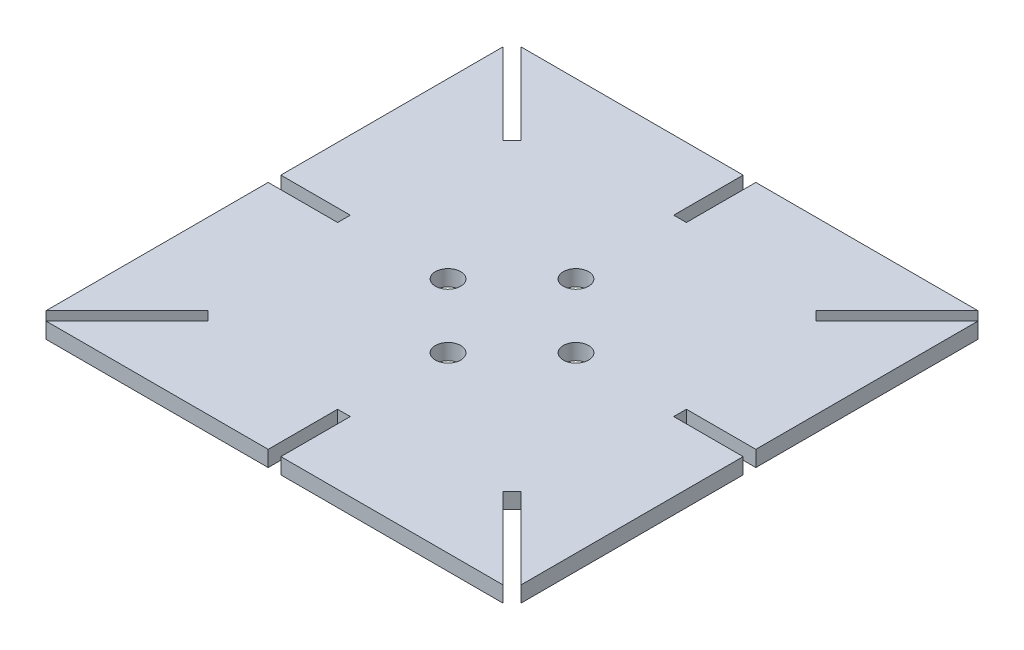
ISO-10303-21;
HEADER;
FILE_DESCRIPTION(('STEP AP214'),'2;1');
FILE_NAME('part.step','',(''),(''),'','','');
FILE_SCHEMA(('AUTOMOTIVE_DESIGN { 1 0 10303 214 1 1 1 1 }'));
ENDSEC;
DATA;
#1=APPLICATION_CONTEXT('core data for automotive mechanical design processes');
#2=APPLICATION_PROTOCOL_DEFINITION('international standard','automotive_design',2000,#1);
#3=PRODUCT_CONTEXT('',#1,'mechanical');
#4=PRODUCT('Part','Part','',(#3));
#5=PRODUCT_RELATED_PRODUCT_CATEGORY('part','',(#4));
#6=PRODUCT_DEFINITION_FORMATION('','',#4);
#7=PRODUCT_DEFINITION_CONTEXT('part definition',#1,'design');
#8=PRODUCT_DEFINITION('design','',#6,#7);
#9=PRODUCT_DEFINITION_SHAPE('','',#8);
#10=(LENGTH_UNIT() NAMED_UNIT(*) SI_UNIT(.MILLI.,.METRE.));
#11=(NAMED_UNIT(*) PLANE_ANGLE_UNIT() SI_UNIT($,.RADIAN.));
#12=(NAMED_UNIT(*) SI_UNIT($,.STERADIAN.) SOLID_ANGLE_UNIT());
#13=UNCERTAINTY_MEASURE_WITH_UNIT(LENGTH_MEASURE(1.E-05),#10,'distance_accuracy_value','');
#14=(GEOMETRIC_REPRESENTATION_CONTEXT(3) GLOBAL_UNCERTAINTY_ASSIGNED_CONTEXT((#13)) GLOBAL_UNIT_ASSIGNED_CONTEXT((#10,
#11,#12)) REPRESENTATION_CONTEXT('',''));
#15=CARTESIAN_POINT('',(0.,0.,0.));
#16=DIRECTION('',(0.,0.,1.));
#17=DIRECTION('',(1.,0.,0.));
#18=AXIS2_PLACEMENT_3D('',#15,#16,#17);
#19=CARTESIAN_POINT('',(0.800000000000003,2.,0.));
#20=DIRECTION('',(-1.,0.,0.));
#21=DIRECTION('',(0.,0.,1.));
#22=AXIS2_PLACEMENT_3D('',#19,#20,#21);
#23=PLANE('',#22);
#24=DIRECTION('',(0.,0.,-1.));
#25=VECTOR('',#24,1.);
#26=CARTESIAN_POINT('',(0.800000000000003,0.,0.));
#27=LINE('',#26,#25);
#28=CARTESIAN_POINT('',(0.799999999999728,0.,30.));
#29=VERTEX_POINT('',#28);
#30=CARTESIAN_POINT('',(0.799999999999775,0.,21.23));
#31=VERTEX_POINT('',#30);
#32=EDGE_CURVE('E443',#29,#31,#27,.T.);
#33=ORIENTED_EDGE('',*,*,#32,.F.);
#34=DIRECTION('',(0.,-1.,0.));
#35=VECTOR('',#34,1.);
#36=CARTESIAN_POINT('',(0.799999999999728,2.,30.));
#37=LINE('',#36,#35);
#38=CARTESIAN_POINT('',(0.799999999999728,2.,30.));
#39=VERTEX_POINT('',#38);
#40=EDGE_CURVE('E12',#39,#29,#37,.T.);
#41=ORIENTED_EDGE('',*,*,#40,.F.);
#42=DIRECTION('',(0.,0.,-1.));
#43=VECTOR('',#42,1.);
#44=CARTESIAN_POINT('',(0.800000000000003,2.,0.));
#45=LINE('',#44,#43);
#46=CARTESIAN_POINT('',(0.799999999999775,2.,21.23));
#47=VERTEX_POINT('',#46);
#48=EDGE_CURVE('E288',#39,#47,#45,.T.);
#49=ORIENTED_EDGE('',*,*,#48,.T.);
#50=DIRECTION('',(0.,-1.,0.));
#51=VECTOR('',#50,1.);
#52=CARTESIAN_POINT('',(0.799999999999775,2.,21.23));
#53=LINE('',#52,#51);
#54=EDGE_CURVE('E164',#47,#31,#53,.T.);
#55=ORIENTED_EDGE('',*,*,#54,.T.);
#56=EDGE_LOOP('',(#33,#41,#49,#55));
#57=FACE_BOUND('',#56,.T.);
#58=ADVANCED_FACE('F40',(#57),#23,.T.);
#59=CARTESIAN_POINT('',(0.,2.,30.));
#60=DIRECTION('',(0.,0.,1.));
#61=DIRECTION('',(1.,0.,0.));
#62=AXIS2_PLACEMENT_3D('',#59,#60,#61);
#63=PLANE('',#62);
#64=DIRECTION('',(-1.,0.,0.));
#65=VECTOR('',#64,1.);
#66=CARTESIAN_POINT('',(0.,0.,30.));
#67=LINE('',#66,#65);
#68=CARTESIAN_POINT('',(28.8686291501013,0.,30.0000000000002));
#69=VERTEX_POINT('',#68);
#70=EDGE_CURVE('E445',#69,#29,#67,.T.);
#71=ORIENTED_EDGE('',*,*,#70,.F.);
#72=DIRECTION('',(0.,-1.,0.));
#73=VECTOR('',#72,1.);
#74=CARTESIAN_POINT('',(28.8686291501013,2.,30.0000000000002));
#75=LINE('',#74,#73);
#76=CARTESIAN_POINT('',(28.8686291501013,2.,30.0000000000002));
#77=VERTEX_POINT('',#76);
#78=EDGE_CURVE('E49',#77,#69,#75,.T.);
#79=ORIENTED_EDGE('',*,*,#78,.F.);
#80=DIRECTION('',(-1.,0.,0.));
#81=VECTOR('',#80,1.);
#82=CARTESIAN_POINT('',(0.,2.,30.));
#83=LINE('',#82,#81);
#84=EDGE_CURVE('E278',#77,#39,#83,.T.);
#85=ORIENTED_EDGE('',*,*,#84,.T.);
#86=ORIENTED_EDGE('',*,*,#40,.T.);
#87=EDGE_LOOP('',(#71,#79,#85,#86));
#88=FACE_BOUND('',#87,.T.);
#89=ADVANCED_FACE('F593',(#88),#63,.T.);
#90=CARTESIAN_POINT('',(-0.565685424949254,2.,0.565685424949247));
#91=DIRECTION('',(0.707106781186552,0.,-0.707106781186543));
#92=DIRECTION('',(-0.707106781186543,0.,-0.707106781186552));
#93=AXIS2_PLACEMENT_3D('',#90,#91,#92);
#94=PLANE('',#93);
#95=DIRECTION('',(0.707106781186543,0.,0.707106781186552));
#96=VECTOR('',#95,1.);
#97=CARTESIAN_POINT('',(-0.565685424949254,0.,0.565685424949247));
#98=LINE('',#97,#96);
#99=CARTESIAN_POINT('',(18.6274602168204,0.,19.7588310667191));
#100=VERTEX_POINT('',#99);
#101=EDGE_CURVE('E448',#100,#69,#98,.T.);
#102=ORIENTED_EDGE('',*,*,#101,.F.);
#103=DIRECTION('',(0.,-1.,0.));
#104=VECTOR('',#103,1.);
#105=CARTESIAN_POINT('',(18.6274602168204,2.,19.7588310667191));
#106=LINE('',#105,#104);
#107=CARTESIAN_POINT('',(18.6274602168204,2.,19.7588310667191));
#108=VERTEX_POINT('',#107);
#109=EDGE_CURVE('E587',#108,#100,#106,.T.);
#110=ORIENTED_EDGE('',*,*,#109,.F.);
#111=DIRECTION('',(0.707106781186543,0.,0.707106781186552));
#112=VECTOR('',#111,1.);
#113=CARTESIAN_POINT('',(-0.565685424949254,2.,0.565685424949247));
#114=LINE('',#113,#112);
#115=EDGE_CURVE('E287',#108,#77,#114,.T.);
#116=ORIENTED_EDGE('',*,*,#115,.T.);
#117=ORIENTED_EDGE('',*,*,#78,.T.);
#118=EDGE_LOOP('',(#102,#110,#116,#117));
#119=FACE_BOUND('',#118,.T.);
#120=ADVANCED_FACE('F591',(#119),#94,.T.);
#121=CARTESIAN_POINT('',(19.1931456417695,2.,19.19314564177));
#122=DIRECTION('',(-0.707106781186539,0.,-0.707106781186556));
#123=DIRECTION('',(-0.707106781186556,0.,0.707106781186539));
#124=AXIS2_PLACEMENT_3D('',#121,#122,#123);
#125=PLANE('',#124);
#126=DIRECTION('',(0.707106781186556,0.,-0.707106781186539));
#127=VECTOR('',#126,1.);
#128=CARTESIAN_POINT('',(19.1931456417695,0.,19.19314564177));
#129=LINE('',#128,#127);
#130=CARTESIAN_POINT('',(19.7588310667189,0.,18.6274602168207));
#131=VERTEX_POINT('',#130);
#132=EDGE_CURVE('E451',#100,#131,#129,.T.);
#133=ORIENTED_EDGE('',*,*,#132,.T.);
#134=DIRECTION('',(0.,-1.,0.));
#135=VECTOR('',#134,1.);
#136=CARTESIAN_POINT('',(19.7588310667189,2.,18.6274602168207));
#137=LINE('',#136,#135);
#138=CARTESIAN_POINT('',(19.7588310667189,2.,18.6274602168207));
#139=VERTEX_POINT('',#138);
#140=EDGE_CURVE('E584',#139,#131,#137,.T.);
#141=ORIENTED_EDGE('',*,*,#140,.F.);
#142=DIRECTION('',(0.707106781186556,0.,-0.707106781186539));
#143=VECTOR('',#142,1.);
#144=CARTESIAN_POINT('',(19.1931456417695,2.,19.19314564177));
#145=LINE('',#144,#143);
#146=EDGE_CURVE('E294',#108,#139,#145,.T.);
#147=ORIENTED_EDGE('',*,*,#146,.F.);
#148=ORIENTED_EDGE('',*,*,#109,.T.);
#149=EDGE_LOOP('',(#133,#141,#147,#148));
#150=FACE_BOUND('',#149,.T.);
#151=ADVANCED_FACE('F598',(#150),#125,.F.);
#152=CARTESIAN_POINT('',(0.565685424949254,2.,-0.565685424949245));
#153=DIRECTION('',(0.707106781186553,0.,-0.707106781186542));
#154=DIRECTION('',(-0.707106781186542,0.,-0.707106781186553));
#155=AXIS2_PLACEMENT_3D('',#152,#153,#154);
#156=PLANE('',#155);
#157=DIRECTION('',(0.707106781186542,0.,0.707106781186553));
#158=VECTOR('',#157,1.);
#159=CARTESIAN_POINT('',(0.565685424949254,0.,-0.565685424949245));
#160=LINE('',#159,#158);
#161=CARTESIAN_POINT('',(29.9999999999998,0.,28.8686291501017));
#162=VERTEX_POINT('',#161);
#163=EDGE_CURVE('E454',#131,#162,#160,.T.);
#164=ORIENTED_EDGE('',*,*,#163,.T.);
#165=DIRECTION('',(0.,-1.,0.));
#166=VECTOR('',#165,1.);
#167=CARTESIAN_POINT('',(29.9999999999998,2.,28.8686291501017));
#168=LINE('',#167,#166);
#169=CARTESIAN_POINT('',(29.9999999999998,2.,28.8686291501017));
#170=VERTEX_POINT('',#169);
#171=EDGE_CURVE('E582',#170,#162,#168,.T.);
#172=ORIENTED_EDGE('',*,*,#171,.F.);
#173=DIRECTION('',(0.707106781186542,0.,0.707106781186553));
#174=VECTOR('',#173,1.);
#175=CARTESIAN_POINT('',(0.565685424949254,2.,-0.565685424949245));
#176=LINE('',#175,#174);
#177=EDGE_CURVE('E316',#139,#170,#176,.T.);
#178=ORIENTED_EDGE('',*,*,#177,.F.);
#179=ORIENTED_EDGE('',*,*,#140,.T.);
#180=EDGE_LOOP('',(#164,#172,#178,#179));
#181=FACE_BOUND('',#180,.T.);
#182=ADVANCED_FACE('F604',(#181),#156,.F.);
#183=CARTESIAN_POINT('',(30.,2.,0.));
#184=DIRECTION('',(1.,0.,0.));
#185=DIRECTION('',(0.,0.,-1.));
#186=AXIS2_PLACEMENT_3D('',#183,#184,#185);
#187=PLANE('',#186);
#188=DIRECTION('',(0.,0.,1.));
#189=VECTOR('',#188,1.);
#190=CARTESIAN_POINT('',(30.,0.,0.));
#191=LINE('',#190,#189);
#192=CARTESIAN_POINT('',(30.,0.,0.800000000000205));
#193=VERTEX_POINT('',#192);
#194=EDGE_CURVE('E457',#193,#162,#191,.T.);
#195=ORIENTED_EDGE('',*,*,#194,.F.);
#196=DIRECTION('',(0.,-1.,0.));
#197=VECTOR('',#196,1.);
#198=CARTESIAN_POINT('',(30.,2.,0.800000000000205));
#199=LINE('',#198,#197);
#200=CARTESIAN_POINT('',(30.,2.,0.800000000000205));
#201=VERTEX_POINT('',#200);
#202=EDGE_CURVE('E580',#201,#193,#199,.T.);
#203=ORIENTED_EDGE('',*,*,#202,.F.);
#204=DIRECTION('',(0.,0.,1.));
#205=VECTOR('',#204,1.);
#206=CARTESIAN_POINT('',(30.,2.,0.));
#207=LINE('',#206,#205);
#208=EDGE_CURVE('E320',#201,#170,#207,.T.);
#209=ORIENTED_EDGE('',*,*,#208,.T.);
#210=ORIENTED_EDGE('',*,*,#171,.T.);
#211=EDGE_LOOP('',(#195,#203,#209,#210));
#212=FACE_BOUND('',#211,.T.);
#213=ADVANCED_FACE('F607',(#212),#187,.T.);
#214=CARTESIAN_POINT('',(0.,2.,0.800000000000003));
#215=DIRECTION('',(0.,0.,1.));
#216=DIRECTION('',(1.,0.,0.));
#217=AXIS2_PLACEMENT_3D('',#214,#215,#216);
#218=PLANE('',#217);
#219=DIRECTION('',(-1.,0.,0.));
#220=VECTOR('',#219,1.);
#221=CARTESIAN_POINT('',(0.,0.,0.800000000000003));
#222=LINE('',#221,#220);
#223=CARTESIAN_POINT('',(21.23,0.,0.800000000000146));
#224=VERTEX_POINT('',#223);
#225=EDGE_CURVE('E460',#193,#224,#222,.T.);
#226=ORIENTED_EDGE('',*,*,#225,.T.);
#227=DIRECTION('',(0.,-1.,0.));
#228=VECTOR('',#227,1.);
#229=CARTESIAN_POINT('',(21.23,2.,0.800000000000146));
#230=LINE('',#229,#228);
#231=CARTESIAN_POINT('',(21.23,2.,0.800000000000146));
#232=VERTEX_POINT('',#231);
#233=EDGE_CURVE('E577',#232,#224,#230,.T.);
#234=ORIENTED_EDGE('',*,*,#233,.F.);
#235=DIRECTION('',(-1.,0.,0.));
#236=VECTOR('',#235,1.);
#237=CARTESIAN_POINT('',(0.,2.,0.800000000000003));
#238=LINE('',#237,#236);
#239=EDGE_CURVE('E328',#201,#232,#238,.T.);
#240=ORIENTED_EDGE('',*,*,#239,.F.);
#241=ORIENTED_EDGE('',*,*,#202,.T.);
#242=EDGE_LOOP('',(#226,#234,#240,#241));
#243=FACE_BOUND('',#242,.T.);
#244=ADVANCED_FACE('F966',(#243),#218,.F.);
#245=CARTESIAN_POINT('',(21.23,2.,1.84140896974939E-13));
#246=DIRECTION('',(-1.,0.,0.));
#247=DIRECTION('',(0.,0.,1.));
#248=AXIS2_PLACEMENT_3D('',#245,#246,#247);
#249=PLANE('',#248);
#250=DIRECTION('',(0.,0.,-1.));
#251=VECTOR('',#250,1.);
#252=CARTESIAN_POINT('',(21.23,0.,1.84140896974939E-13));
#253=LINE('',#252,#251);
#254=CARTESIAN_POINT('',(21.23,0.,-0.799999999999849));
#255=VERTEX_POINT('',#254);
#256=EDGE_CURVE('E464',#224,#255,#253,.T.);
#257=ORIENTED_EDGE('',*,*,#256,.T.);
#258=DIRECTION('',(0.,-1.,0.));
#259=VECTOR('',#258,1.);
#260=CARTESIAN_POINT('',(21.23,2.,-0.799999999999849));
#261=LINE('',#260,#259);
#262=CARTESIAN_POINT('',(21.23,2.,-0.799999999999849));
#263=VERTEX_POINT('',#262);
#264=EDGE_CURVE('E575',#263,#255,#261,.T.);
#265=ORIENTED_EDGE('',*,*,#264,.F.);
#266=DIRECTION('',(0.,0.,-1.));
#267=VECTOR('',#266,1.);
#268=CARTESIAN_POINT('',(21.23,2.,1.84140896974939E-13));
#269=LINE('',#268,#267);
#270=EDGE_CURVE('E332',#232,#263,#269,.T.);
#271=ORIENTED_EDGE('',*,*,#270,.F.);
#272=ORIENTED_EDGE('',*,*,#233,.T.);
#273=EDGE_LOOP('',(#257,#265,#271,#272));
#274=FACE_BOUND('',#273,.T.);
#275=ADVANCED_FACE('F958',(#274),#249,.F.);
#276=CARTESIAN_POINT('',(0.,2.,-0.800000000000003));
#277=DIRECTION('',(0.,0.,1.));
#278=DIRECTION('',(1.,0.,0.));
#279=AXIS2_PLACEMENT_3D('',#276,#277,#278);
#280=PLANE('',#279);
#281=DIRECTION('',(-1.,0.,0.));
#282=VECTOR('',#281,1.);
#283=CARTESIAN_POINT('',(0.,0.,-0.800000000000003));
#284=LINE('',#283,#282);
#285=CARTESIAN_POINT('',(30.,0.,-0.799999999999786));
#286=VERTEX_POINT('',#285);
#287=EDGE_CURVE('E467',#286,#255,#284,.T.);
#288=ORIENTED_EDGE('',*,*,#287,.F.);
#289=DIRECTION('',(0.,-1.,0.));
#290=VECTOR('',#289,1.);
#291=CARTESIAN_POINT('',(30.,2.,-0.799999999999786));
#292=LINE('',#291,#290);
#293=CARTESIAN_POINT('',(30.,2.,-0.799999999999786));
#294=VERTEX_POINT('',#293);
#295=EDGE_CURVE('E573',#294,#286,#292,.T.);
#296=ORIENTED_EDGE('',*,*,#295,.F.);
#297=DIRECTION('',(-1.,0.,0.));
#298=VECTOR('',#297,1.);
#299=CARTESIAN_POINT('',(0.,2.,-0.800000000000003));
#300=LINE('',#299,#298);
#301=EDGE_CURVE('E336',#294,#263,#300,.T.);
#302=ORIENTED_EDGE('',*,*,#301,.T.);
#303=ORIENTED_EDGE('',*,*,#264,.T.);
#304=EDGE_LOOP('',(#288,#296,#302,#303));
#305=FACE_BOUND('',#304,.T.);
#306=ADVANCED_FACE('F627',(#305),#280,.T.);
#307=CARTESIAN_POINT('',(30.0000000000001,0.,-28.8686291501014));
#308=VERTEX_POINT('',#307);
#309=EDGE_CURVE('E461',#308,#286,#191,.T.);
#310=ORIENTED_EDGE('',*,*,#309,.F.);
#311=DIRECTION('',(0.,-1.,0.));
#312=VECTOR('',#311,1.);
#313=CARTESIAN_POINT('',(30.0000000000001,2.,-28.8686291501014));
#314=LINE('',#313,#312);
#315=CARTESIAN_POINT('',(30.0000000000001,2.,-28.8686291501014));
#316=VERTEX_POINT('',#315);
#317=EDGE_CURVE('E571',#316,#308,#314,.T.);
#318=ORIENTED_EDGE('',*,*,#317,.F.);
#319=EDGE_CURVE('E341',#316,#294,#207,.T.);
#320=ORIENTED_EDGE('',*,*,#319,.T.);
#321=ORIENTED_EDGE('',*,*,#295,.T.);
#322=EDGE_LOOP('',(#310,#318,#320,#321));
#323=FACE_BOUND('',#322,.T.);
#324=ADVANCED_FACE('F629',(#323),#187,.T.);
#325=CARTESIAN_POINT('',(0.565685424949254,2.,0.565685424949257));
#326=DIRECTION('',(-0.707106781186546,0.,-0.70710678118655));
#327=DIRECTION('',(-0.70710678118655,0.,0.707106781186546));
#328=AXIS2_PLACEMENT_3D('',#325,#326,#327);
#329=PLANE('',#328);
#330=DIRECTION('',(0.70710678118655,0.,-0.707106781186546));
#331=VECTOR('',#330,1.);
#332=CARTESIAN_POINT('',(0.565685424949254,0.,0.565685424949257));
#333=LINE('',#332,#331);
#334=CARTESIAN_POINT('',(19.7588310667191,0.,-18.6274602168204));
#335=VERTEX_POINT('',#334);
#336=EDGE_CURVE('E470',#335,#308,#333,.T.);
#337=ORIENTED_EDGE('',*,*,#336,.F.);
#338=DIRECTION('',(0.,-1.,0.));
#339=VECTOR('',#338,1.);
#340=CARTESIAN_POINT('',(19.7588310667191,2.,-18.6274602168204));
#341=LINE('',#340,#339);
#342=CARTESIAN_POINT('',(19.7588310667191,2.,-18.6274602168204));
#343=VERTEX_POINT('',#342);
#344=EDGE_CURVE('E569',#343,#335,#341,.T.);
#345=ORIENTED_EDGE('',*,*,#344,.F.);
#346=DIRECTION('',(0.70710678118655,0.,-0.707106781186546));
#347=VECTOR('',#346,1.);
#348=CARTESIAN_POINT('',(0.565685424949254,2.,0.565685424949257));
#349=LINE('',#348,#347);
#350=EDGE_CURVE('E342',#343,#316,#349,.T.);
#351=ORIENTED_EDGE('',*,*,#350,.T.);
#352=ORIENTED_EDGE('',*,*,#317,.T.);
#353=EDGE_LOOP('',(#337,#345,#351,#352));
#354=FACE_BOUND('',#353,.T.);
#355=ADVANCED_FACE('F619',(#354),#329,.T.);
#356=CARTESIAN_POINT('',(19.1931456417699,2.,-19.1931456417696));
#357=DIRECTION('',(-0.707106781186552,0.,0.707106781186543));
#358=DIRECTION('',(0.707106781186543,0.,0.707106781186552));
#359=AXIS2_PLACEMENT_3D('',#356,#357,#358);
#360=PLANE('',#359);
#361=DIRECTION('',(-0.707106781186543,0.,-0.707106781186552));
#362=VECTOR('',#361,1.);
#363=CARTESIAN_POINT('',(19.1931456417699,0.,-19.1931456417696));
#364=LINE('',#363,#362);
#365=CARTESIAN_POINT('',(18.6274602168206,0.,-19.7588310667189));
#366=VERTEX_POINT('',#365);
#367=EDGE_CURVE('E473',#335,#366,#364,.T.);
#368=ORIENTED_EDGE('',*,*,#367,.T.);
#369=DIRECTION('',(0.,-1.,0.));
#370=VECTOR('',#369,1.);
#371=CARTESIAN_POINT('',(18.6274602168206,2.,-19.7588310667189));
#372=LINE('',#371,#370);
#373=CARTESIAN_POINT('',(18.6274602168206,2.,-19.7588310667189));
#374=VERTEX_POINT('',#373);
#375=EDGE_CURVE('E566',#374,#366,#372,.T.);
#376=ORIENTED_EDGE('',*,*,#375,.F.);
#377=DIRECTION('',(-0.707106781186543,0.,-0.707106781186552));
#378=VECTOR('',#377,1.);
#379=CARTESIAN_POINT('',(19.1931456417699,2.,-19.1931456417696));
#380=LINE('',#379,#378);
#381=EDGE_CURVE('E351',#343,#374,#380,.T.);
#382=ORIENTED_EDGE('',*,*,#381,.F.);
#383=ORIENTED_EDGE('',*,*,#344,.T.);
#384=EDGE_LOOP('',(#368,#376,#382,#383));
#385=FACE_BOUND('',#384,.T.);
#386=ADVANCED_FACE('F632',(#385),#360,.F.);
#387=CARTESIAN_POINT('',(-0.565685424949245,2.,-0.565685424949249));
#388=DIRECTION('',(-0.707106781186545,0.,-0.70710678118655));
#389=DIRECTION('',(-0.70710678118655,0.,0.707106781186545));
#390=AXIS2_PLACEMENT_3D('',#387,#388,#389);
#391=PLANE('',#390);
#392=DIRECTION('',(0.70710678118655,0.,-0.707106781186545));
#393=VECTOR('',#392,1.);
#394=CARTESIAN_POINT('',(-0.565685424949245,0.,-0.565685424949249));
#395=LINE('',#394,#393);
#396=CARTESIAN_POINT('',(28.8686291501016,0.,-29.9999999999999));
#397=VERTEX_POINT('',#396);
#398=EDGE_CURVE('E476',#366,#397,#395,.T.);
#399=ORIENTED_EDGE('',*,*,#398,.T.);
#400=DIRECTION('',(0.,-1.,0.));
#401=VECTOR('',#400,1.);
#402=CARTESIAN_POINT('',(28.8686291501016,2.,-29.9999999999999));
#403=LINE('',#402,#401);
#404=CARTESIAN_POINT('',(28.8686291501016,2.,-29.9999999999999));
#405=VERTEX_POINT('',#404);
#406=EDGE_CURVE('E564',#405,#397,#403,.T.);
#407=ORIENTED_EDGE('',*,*,#406,.F.);
#408=DIRECTION('',(0.70710678118655,0.,-0.707106781186545));
#409=VECTOR('',#408,1.);
#410=CARTESIAN_POINT('',(-0.565685424949245,2.,-0.565685424949249));
#411=LINE('',#410,#409);
#412=EDGE_CURVE('E355',#374,#405,#411,.T.);
#413=ORIENTED_EDGE('',*,*,#412,.F.);
#414=ORIENTED_EDGE('',*,*,#375,.T.);
#415=EDGE_LOOP('',(#399,#407,#413,#414));
#416=FACE_BOUND('',#415,.T.);
#417=ADVANCED_FACE('F634',(#416),#391,.F.);
#418=CARTESIAN_POINT('',(0.,2.,-30.));
#419=DIRECTION('',(0.,0.,-1.));
#420=DIRECTION('',(-1.,0.,0.));
#421=AXIS2_PLACEMENT_3D('',#418,#419,#420);
#422=PLANE('',#421);
#423=DIRECTION('',(1.,0.,0.));
#424=VECTOR('',#423,1.);
#425=CARTESIAN_POINT('',(0.,0.,-30.));
#426=LINE('',#425,#424);
#427=CARTESIAN_POINT('',(0.800000000000103,0.,-30.));
#428=VERTEX_POINT('',#427);
#429=EDGE_CURVE('E479',#428,#397,#426,.T.);
#430=ORIENTED_EDGE('',*,*,#429,.F.);
#431=DIRECTION('',(0.,-1.,0.));
#432=VECTOR('',#431,1.);
#433=CARTESIAN_POINT('',(0.800000000000103,2.,-30.));
#434=LINE('',#433,#432);
#435=CARTESIAN_POINT('',(0.800000000000103,2.,-30.));
#436=VERTEX_POINT('',#435);
#437=EDGE_CURVE('E562',#436,#428,#434,.T.);
#438=ORIENTED_EDGE('',*,*,#437,.F.);
#439=DIRECTION('',(1.,0.,0.));
#440=VECTOR('',#439,1.);
#441=CARTESIAN_POINT('',(0.,2.,-30.));
#442=LINE('',#441,#440);
#443=EDGE_CURVE('E359',#436,#405,#442,.T.);
#444=ORIENTED_EDGE('',*,*,#443,.T.);
#445=ORIENTED_EDGE('',*,*,#406,.T.);
#446=EDGE_LOOP('',(#430,#438,#444,#445));
#447=FACE_BOUND('',#446,.T.);
#448=ADVANCED_FACE('F642',(#447),#422,.T.);
#449=CARTESIAN_POINT('',(0.800000000000007,2.,0.));
#450=DIRECTION('',(1.,0.,0.));
#451=DIRECTION('',(0.,0.,-1.));
#452=AXIS2_PLACEMENT_3D('',#449,#450,#451);
#453=PLANE('',#452);
#454=DIRECTION('',(0.,0.,1.));
#455=VECTOR('',#454,1.);
#456=CARTESIAN_POINT('',(0.800000000000007,0.,0.));
#457=LINE('',#456,#455);
#458=CARTESIAN_POINT('',(0.800000000000075,0.,-21.23));
#459=VERTEX_POINT('',#458);
#460=EDGE_CURVE('E482',#428,#459,#457,.T.);
#461=ORIENTED_EDGE('',*,*,#460,.T.);
#462=DIRECTION('',(0.,-1.,0.));
#463=VECTOR('',#462,1.);
#464=CARTESIAN_POINT('',(0.800000000000075,2.,-21.23));
#465=LINE('',#464,#463);
#466=CARTESIAN_POINT('',(0.800000000000075,2.,-21.23));
#467=VERTEX_POINT('',#466);
#468=EDGE_CURVE('E559',#467,#459,#465,.T.);
#469=ORIENTED_EDGE('',*,*,#468,.F.);
#470=DIRECTION('',(0.,0.,1.));
#471=VECTOR('',#470,1.);
#472=CARTESIAN_POINT('',(0.800000000000007,2.,0.));
#473=LINE('',#472,#471);
#474=EDGE_CURVE('E364',#436,#467,#473,.T.);
#475=ORIENTED_EDGE('',*,*,#474,.F.);
#476=ORIENTED_EDGE('',*,*,#437,.T.);
#477=EDGE_LOOP('',(#461,#469,#475,#476));
#478=FACE_BOUND('',#477,.T.);
#479=ADVANCED_FACE('F645',(#478),#453,.F.);
#480=CARTESIAN_POINT('',(0.,2.,-21.23));
#481=DIRECTION('',(0.,0.,1.));
#482=DIRECTION('',(1.,0.,0.));
#483=AXIS2_PLACEMENT_3D('',#480,#481,#482);
#484=PLANE('',#483);
#485=DIRECTION('',(-1.,0.,0.));
#486=VECTOR('',#485,1.);
#487=CARTESIAN_POINT('',(0.,0.,-21.23));
#488=LINE('',#487,#486);
#489=CARTESIAN_POINT('',(-0.79999999999992,0.,-21.23));
#490=VERTEX_POINT('',#489);
#491=EDGE_CURVE('E486',#459,#490,#488,.T.);
#492=ORIENTED_EDGE('',*,*,#491,.T.);
#493=DIRECTION('',(0.,-1.,0.));
#494=VECTOR('',#493,1.);
#495=CARTESIAN_POINT('',(-0.79999999999992,2.,-21.23));
#496=LINE('',#495,#494);
#497=CARTESIAN_POINT('',(-0.79999999999992,2.,-21.23));
#498=VERTEX_POINT('',#497);
#499=EDGE_CURVE('E557',#498,#490,#496,.T.);
#500=ORIENTED_EDGE('',*,*,#499,.F.);
#501=DIRECTION('',(-1.,0.,0.));
#502=VECTOR('',#501,1.);
#503=CARTESIAN_POINT('',(0.,2.,-21.23));
#504=LINE('',#503,#502);
#505=EDGE_CURVE('E647',#467,#498,#504,.T.);
#506=ORIENTED_EDGE('',*,*,#505,.F.);
#507=ORIENTED_EDGE('',*,*,#468,.T.);
#508=EDGE_LOOP('',(#492,#500,#506,#507));
#509=FACE_BOUND('',#508,.T.);
#510=ADVANCED_FACE('F901',(#509),#484,.F.);
#511=CARTESIAN_POINT('',(-0.799999999999999,2.,0.));
#512=DIRECTION('',(1.,0.,0.));
#513=DIRECTION('',(0.,0.,-1.));
#514=AXIS2_PLACEMENT_3D('',#511,#512,#513);
#515=PLANE('',#514);
#516=DIRECTION('',(0.,0.,1.));
#517=VECTOR('',#516,1.);
#518=CARTESIAN_POINT('',(-0.799999999999999,0.,0.));
#519=LINE('',#518,#517);
#520=CARTESIAN_POINT('',(-0.799999999999887,0.,-30.));
#521=VERTEX_POINT('',#520);
#522=EDGE_CURVE('E489',#521,#490,#519,.T.);
#523=ORIENTED_EDGE('',*,*,#522,.F.);
#524=DIRECTION('',(0.,-1.,0.));
#525=VECTOR('',#524,1.);
#526=CARTESIAN_POINT('',(-0.799999999999887,2.,-30.));
#527=LINE('',#526,#525);
#528=CARTESIAN_POINT('',(-0.799999999999887,2.,-30.));
#529=VERTEX_POINT('',#528);
#530=EDGE_CURVE('E555',#529,#521,#527,.T.);
#531=ORIENTED_EDGE('',*,*,#530,.F.);
#532=DIRECTION('',(0.,0.,1.));
#533=VECTOR('',#532,1.);
#534=CARTESIAN_POINT('',(-0.799999999999999,2.,0.));
#535=LINE('',#534,#533);
#536=EDGE_CURVE('E384',#529,#498,#535,.T.);
#537=ORIENTED_EDGE('',*,*,#536,.T.);
#538=ORIENTED_EDGE('',*,*,#499,.T.);
#539=EDGE_LOOP('',(#523,#531,#537,#538));
#540=FACE_BOUND('',#539,.T.);
#541=ADVANCED_FACE('F893',(#540),#515,.T.);
#542=CARTESIAN_POINT('',(-28.8686291501015,0.,-30.));
#543=VERTEX_POINT('',#542);
#544=EDGE_CURVE('E483',#543,#521,#426,.T.);
#545=ORIENTED_EDGE('',*,*,#544,.F.);
#546=DIRECTION('',(0.,-1.,0.));
#547=VECTOR('',#546,1.);
#548=CARTESIAN_POINT('',(-28.8686291501015,2.,-30.));
#549=LINE('',#548,#547);
#550=CARTESIAN_POINT('',(-28.8686291501015,2.,-30.));
#551=VERTEX_POINT('',#550);
#552=EDGE_CURVE('E553',#551,#543,#549,.T.);
#553=ORIENTED_EDGE('',*,*,#552,.F.);
#554=EDGE_CURVE('E365',#551,#529,#442,.T.);
#555=ORIENTED_EDGE('',*,*,#554,.T.);
#556=ORIENTED_EDGE('',*,*,#530,.T.);
#557=EDGE_LOOP('',(#545,#553,#555,#556));
#558=FACE_BOUND('',#557,.T.);
#559=ADVANCED_FACE('F660',(#558),#422,.T.);
#560=CARTESIAN_POINT('',(0.565685424949248,2.,-0.565685424949248));
#561=DIRECTION('',(-0.707106781186547,0.,0.707106781186548));
#562=DIRECTION('',(0.707106781186548,0.,0.707106781186547));
#563=AXIS2_PLACEMENT_3D('',#560,#561,#562);
#564=PLANE('',#563);
#565=DIRECTION('',(-0.707106781186548,0.,-0.707106781186547));
#566=VECTOR('',#565,1.);
#567=CARTESIAN_POINT('',(0.565685424949248,0.,-0.565685424949248));
#568=LINE('',#567,#566);
#569=CARTESIAN_POINT('',(-18.6274602168205,0.,-19.758831066719));
#570=VERTEX_POINT('',#569);
#571=EDGE_CURVE('E492',#570,#543,#568,.T.);
#572=ORIENTED_EDGE('',*,*,#571,.F.);
#573=DIRECTION('',(0.,-1.,0.));
#574=VECTOR('',#573,1.);
#575=CARTESIAN_POINT('',(-18.6274602168205,2.,-19.758831066719));
#576=LINE('',#575,#574);
#577=CARTESIAN_POINT('',(-18.6274602168205,2.,-19.758831066719));
#578=VERTEX_POINT('',#577);
#579=EDGE_CURVE('E551',#578,#570,#576,.T.);
#580=ORIENTED_EDGE('',*,*,#579,.F.);
#581=DIRECTION('',(-0.707106781186548,0.,-0.707106781186547));
#582=VECTOR('',#581,1.);
#583=CARTESIAN_POINT('',(0.565685424949248,2.,-0.565685424949248));
#584=LINE('',#583,#582);
#585=EDGE_CURVE('E379',#578,#551,#584,.T.);
#586=ORIENTED_EDGE('',*,*,#585,.T.);
#587=ORIENTED_EDGE('',*,*,#552,.T.);
#588=EDGE_LOOP('',(#572,#580,#586,#587));
#589=FACE_BOUND('',#588,.T.);
#590=ADVANCED_FACE('F665',(#589),#564,.T.);
#591=CARTESIAN_POINT('',(-19.1931456417697,2.,-19.1931456417698));
#592=DIRECTION('',(0.707106781186545,0.,0.70710678118655));
#593=DIRECTION('',(0.70710678118655,0.,-0.707106781186545));
#594=AXIS2_PLACEMENT_3D('',#591,#592,#593);
#595=PLANE('',#594);
#596=DIRECTION('',(-0.70710678118655,0.,0.707106781186545));
#597=VECTOR('',#596,1.);
#598=CARTESIAN_POINT('',(-19.1931456417697,0.,-19.1931456417698));
#599=LINE('',#598,#597);
#600=CARTESIAN_POINT('',(-19.758831066719,0.,-18.6274602168205));
#601=VERTEX_POINT('',#600);
#602=EDGE_CURVE('E495',#570,#601,#599,.T.);
#603=ORIENTED_EDGE('',*,*,#602,.T.);
#604=DIRECTION('',(0.,-1.,0.));
#605=VECTOR('',#604,1.);
#606=CARTESIAN_POINT('',(-19.758831066719,2.,-18.6274602168205));
#607=LINE('',#606,#605);
#608=CARTESIAN_POINT('',(-19.758831066719,2.,-18.6274602168205));
#609=VERTEX_POINT('',#608);
#610=EDGE_CURVE('E548',#609,#601,#607,.T.);
#611=ORIENTED_EDGE('',*,*,#610,.F.);
#612=DIRECTION('',(-0.70710678118655,0.,0.707106781186545));
#613=VECTOR('',#612,1.);
#614=CARTESIAN_POINT('',(-19.1931456417697,2.,-19.1931456417698));
#615=LINE('',#614,#613);
#616=EDGE_CURVE('E383',#578,#609,#615,.T.);
#617=ORIENTED_EDGE('',*,*,#616,.F.);
#618=ORIENTED_EDGE('',*,*,#579,.T.);
#619=EDGE_LOOP('',(#603,#611,#617,#618));
#620=FACE_BOUND('',#619,.T.);
#621=ADVANCED_FACE('F670',(#620),#595,.F.);
#622=CARTESIAN_POINT('',(-0.565685424949249,2.,0.565685424949249));
#623=DIRECTION('',(-0.707106781186548,0.,0.707106781186547));
#624=DIRECTION('',(0.707106781186547,0.,0.707106781186548));
#625=AXIS2_PLACEMENT_3D('',#622,#623,#624);
#626=PLANE('',#625);
#627=DIRECTION('',(-0.707106781186547,0.,-0.707106781186548));
#628=VECTOR('',#627,1.);
#629=CARTESIAN_POINT('',(-0.565685424949249,0.,0.565685424949249));
#630=LINE('',#629,#628);
#631=CARTESIAN_POINT('',(-30.,0.,-28.8686291501015));
#632=VERTEX_POINT('',#631);
#633=EDGE_CURVE('E498',#601,#632,#630,.T.);
#634=ORIENTED_EDGE('',*,*,#633,.T.);
#635=DIRECTION('',(0.,-1.,0.));
#636=VECTOR('',#635,1.);
#637=CARTESIAN_POINT('',(-30.,2.,-28.8686291501015));
#638=LINE('',#637,#636);
#639=CARTESIAN_POINT('',(-30.,2.,-28.8686291501015));
#640=VERTEX_POINT('',#639);
#641=EDGE_CURVE('E546',#640,#632,#638,.T.);
#642=ORIENTED_EDGE('',*,*,#641,.F.);
#643=DIRECTION('',(-0.707106781186547,0.,-0.707106781186548));
#644=VECTOR('',#643,1.);
#645=CARTESIAN_POINT('',(-0.565685424949249,2.,0.565685424949249));
#646=LINE('',#645,#644);
#647=EDGE_CURVE('E390',#609,#640,#646,.T.);
#648=ORIENTED_EDGE('',*,*,#647,.F.);
#649=ORIENTED_EDGE('',*,*,#610,.T.);
#650=EDGE_LOOP('',(#634,#642,#648,#649));
#651=FACE_BOUND('',#650,.T.);
#652=ADVANCED_FACE('F675',(#651),#626,.F.);
#653=CARTESIAN_POINT('',(-30.,2.,0.));
#654=DIRECTION('',(-1.,0.,0.));
#655=DIRECTION('',(0.,0.,1.));
#656=AXIS2_PLACEMENT_3D('',#653,#654,#655);
#657=PLANE('',#656);
#658=DIRECTION('',(0.,0.,-1.));
#659=VECTOR('',#658,1.);
#660=CARTESIAN_POINT('',(-30.,0.,0.));
#661=LINE('',#660,#659);
#662=CARTESIAN_POINT('',(-30.,0.,-0.799999999999995));
#663=VERTEX_POINT('',#662);
#664=EDGE_CURVE('E501',#663,#632,#661,.T.);
#665=ORIENTED_EDGE('',*,*,#664,.F.);
#666=DIRECTION('',(0.,-1.,0.));
#667=VECTOR('',#666,1.);
#668=CARTESIAN_POINT('',(-30.,2.,-0.799999999999995));
#669=LINE('',#668,#667);
#670=CARTESIAN_POINT('',(-30.,2.,-0.799999999999995));
#671=VERTEX_POINT('',#670);
#672=EDGE_CURVE('E544',#671,#663,#669,.T.);
#673=ORIENTED_EDGE('',*,*,#672,.F.);
#674=DIRECTION('',(0.,0.,-1.));
#675=VECTOR('',#674,1.);
#676=CARTESIAN_POINT('',(-30.,2.,0.));
#677=LINE('',#676,#675);
#678=EDGE_CURVE('E394',#671,#640,#677,.T.);
#679=ORIENTED_EDGE('',*,*,#678,.T.);
#680=ORIENTED_EDGE('',*,*,#641,.T.);
#681=EDGE_LOOP('',(#665,#673,#679,#680));
#682=FACE_BOUND('',#681,.T.);
#683=ADVANCED_FACE('F678',(#682),#657,.T.);
#684=CARTESIAN_POINT('',(0.,2.,-0.800000000000003));
#685=DIRECTION('',(0.,0.,-1.));
#686=DIRECTION('',(-1.,0.,0.));
#687=AXIS2_PLACEMENT_3D('',#684,#685,#686);
#688=PLANE('',#687);
#689=DIRECTION('',(1.,0.,0.));
#690=VECTOR('',#689,1.);
#691=CARTESIAN_POINT('',(0.,0.,-0.800000000000003));
#692=LINE('',#691,#690);
#693=CARTESIAN_POINT('',(-21.23,0.,-0.799999999999997));
#694=VERTEX_POINT('',#693);
#695=EDGE_CURVE('E504',#663,#694,#692,.T.);
#696=ORIENTED_EDGE('',*,*,#695,.T.);
#697=DIRECTION('',(0.,-1.,0.));
#698=VECTOR('',#697,1.);
#699=CARTESIAN_POINT('',(-21.23,2.,-0.799999999999997));
#700=LINE('',#699,#698);
#701=CARTESIAN_POINT('',(-21.23,2.,-0.799999999999997));
#702=VERTEX_POINT('',#701);
#703=EDGE_CURVE('E541',#702,#694,#700,.T.);
#704=ORIENTED_EDGE('',*,*,#703,.F.);
#705=DIRECTION('',(1.,0.,0.));
#706=VECTOR('',#705,1.);
#707=CARTESIAN_POINT('',(0.,2.,-0.800000000000003));
#708=LINE('',#707,#706);
#709=EDGE_CURVE('E402',#671,#702,#708,.T.);
#710=ORIENTED_EDGE('',*,*,#709,.F.);
#711=ORIENTED_EDGE('',*,*,#672,.T.);
#712=EDGE_LOOP('',(#696,#704,#710,#711));
#713=FACE_BOUND('',#712,.T.);
#714=ADVANCED_FACE('F849',(#713),#688,.F.);
#715=CARTESIAN_POINT('',(-21.23,2.,0.));
#716=DIRECTION('',(1.,0.,0.));
#717=DIRECTION('',(0.,0.,-1.));
#718=AXIS2_PLACEMENT_3D('',#715,#716,#717);
#719=PLANE('',#718);
#720=DIRECTION('',(0.,0.,1.));
#721=VECTOR('',#720,1.);
#722=CARTESIAN_POINT('',(-21.23,0.,0.));
#723=LINE('',#722,#721);
#724=CARTESIAN_POINT('',(-21.23,0.,0.799999999999997));
#725=VERTEX_POINT('',#724);
#726=EDGE_CURVE('E508',#694,#725,#723,.T.);
#727=ORIENTED_EDGE('',*,*,#726,.T.);
#728=DIRECTION('',(0.,-1.,0.));
#729=VECTOR('',#728,1.);
#730=CARTESIAN_POINT('',(-21.23,2.,0.799999999999997));
#731=LINE('',#730,#729);
#732=CARTESIAN_POINT('',(-21.23,2.,0.799999999999997));
#733=VERTEX_POINT('',#732);
#734=EDGE_CURVE('E539',#733,#725,#731,.T.);
#735=ORIENTED_EDGE('',*,*,#734,.F.);
#736=DIRECTION('',(0.,0.,1.));
#737=VECTOR('',#736,1.);
#738=CARTESIAN_POINT('',(-21.23,2.,0.));
#739=LINE('',#738,#737);
#740=EDGE_CURVE('E406',#702,#733,#739,.T.);
#741=ORIENTED_EDGE('',*,*,#740,.F.);
#742=ORIENTED_EDGE('',*,*,#703,.T.);
#743=EDGE_LOOP('',(#727,#735,#741,#742));
#744=FACE_BOUND('',#743,.T.);
#745=ADVANCED_FACE('F841',(#744),#719,.F.);
#746=CARTESIAN_POINT('',(0.,2.,0.800000000000003));
#747=DIRECTION('',(0.,0.,-1.));
#748=DIRECTION('',(-1.,0.,0.));
#749=AXIS2_PLACEMENT_3D('',#746,#747,#748);
#750=PLANE('',#749);
#751=DIRECTION('',(1.,0.,0.));
#752=VECTOR('',#751,1.);
#753=CARTESIAN_POINT('',(0.,0.,0.800000000000003));
#754=LINE('',#753,#752);
#755=CARTESIAN_POINT('',(-30.,0.,0.799999999999995));
#756=VERTEX_POINT('',#755);
#757=EDGE_CURVE('E511',#756,#725,#754,.T.);
#758=ORIENTED_EDGE('',*,*,#757,.F.);
#759=DIRECTION('',(0.,-1.,0.));
#760=VECTOR('',#759,1.);
#761=CARTESIAN_POINT('',(-30.,2.,0.799999999999995));
#762=LINE('',#761,#760);
#763=CARTESIAN_POINT('',(-30.,2.,0.799999999999995));
#764=VERTEX_POINT('',#763);
#765=EDGE_CURVE('E537',#764,#756,#762,.T.);
#766=ORIENTED_EDGE('',*,*,#765,.F.);
#767=DIRECTION('',(1.,0.,0.));
#768=VECTOR('',#767,1.);
#769=CARTESIAN_POINT('',(0.,2.,0.800000000000003));
#770=LINE('',#769,#768);
#771=EDGE_CURVE('E410',#764,#733,#770,.T.);
#772=ORIENTED_EDGE('',*,*,#771,.T.);
#773=ORIENTED_EDGE('',*,*,#734,.T.);
#774=EDGE_LOOP('',(#758,#766,#772,#773));
#775=FACE_BOUND('',#774,.T.);
#776=ADVANCED_FACE('F698',(#775),#750,.T.);
#777=CARTESIAN_POINT('',(-30.0000000000003,0.,28.8686291501012));
#778=VERTEX_POINT('',#777);
#779=EDGE_CURVE('E505',#778,#756,#661,.T.);
#780=ORIENTED_EDGE('',*,*,#779,.F.);
#781=DIRECTION('',(0.,-1.,0.));
#782=VECTOR('',#781,1.);
#783=CARTESIAN_POINT('',(-30.0000000000003,2.,28.8686291501012));
#784=LINE('',#783,#782);
#785=CARTESIAN_POINT('',(-30.0000000000003,2.,28.8686291501012));
#786=VERTEX_POINT('',#785);
#787=EDGE_CURVE('E535',#786,#778,#784,.T.);
#788=ORIENTED_EDGE('',*,*,#787,.F.);
#789=EDGE_CURVE('E415',#786,#764,#677,.T.);
#790=ORIENTED_EDGE('',*,*,#789,.T.);
#791=ORIENTED_EDGE('',*,*,#765,.T.);
#792=EDGE_LOOP('',(#780,#788,#790,#791));
#793=FACE_BOUND('',#792,.T.);
#794=ADVANCED_FACE('F700',(#793),#657,.T.);
#795=CARTESIAN_POINT('',(-0.565685424949244,2.,-0.565685424949255));
#796=DIRECTION('',(0.70710678118654,0.,0.707106781186555));
#797=DIRECTION('',(0.707106781186555,0.,-0.70710678118654));
#798=AXIS2_PLACEMENT_3D('',#795,#796,#797);
#799=PLANE('',#798);
#800=DIRECTION('',(-0.707106781186555,0.,0.70710678118654));
#801=VECTOR('',#800,1.);
#802=CARTESIAN_POINT('',(-0.565685424949244,0.,-0.565685424949255));
#803=LINE('',#802,#801);
#804=CARTESIAN_POINT('',(-19.7588310667192,0.,18.6274602168203));
#805=VERTEX_POINT('',#804);
#806=EDGE_CURVE('E514',#805,#778,#803,.T.);
#807=ORIENTED_EDGE('',*,*,#806,.F.);
#808=DIRECTION('',(0.,-1.,0.));
#809=VECTOR('',#808,1.);
#810=CARTESIAN_POINT('',(-19.7588310667192,2.,18.6274602168203));
#811=LINE('',#810,#809);
#812=CARTESIAN_POINT('',(-19.7588310667192,2.,18.6274602168203));
#813=VERTEX_POINT('',#812);
#814=EDGE_CURVE('E533',#813,#805,#811,.T.);
#815=ORIENTED_EDGE('',*,*,#814,.F.);
#816=DIRECTION('',(-0.707106781186555,0.,0.70710678118654));
#817=VECTOR('',#816,1.);
#818=CARTESIAN_POINT('',(-0.565685424949244,2.,-0.565685424949255));
#819=LINE('',#818,#817);
#820=EDGE_CURVE('E416',#813,#786,#819,.T.);
#821=ORIENTED_EDGE('',*,*,#820,.T.);
#822=ORIENTED_EDGE('',*,*,#787,.T.);
#823=EDGE_LOOP('',(#807,#815,#821,#822));
#824=FACE_BOUND('',#823,.T.);
#825=ADVANCED_FACE('F690',(#824),#799,.T.);
#826=CARTESIAN_POINT('',(-19.19314564177,2.,19.1931456417695));
#827=DIRECTION('',(0.707106781186558,0.,-0.707106781186537));
#828=DIRECTION('',(-0.707106781186537,0.,-0.707106781186558));
#829=AXIS2_PLACEMENT_3D('',#826,#827,#828);
#830=PLANE('',#829);
#831=DIRECTION('',(0.707106781186537,0.,0.707106781186558));
#832=VECTOR('',#831,1.);
#833=CARTESIAN_POINT('',(-19.19314564177,0.,19.1931456417695));
#834=LINE('',#833,#832);
#835=CARTESIAN_POINT('',(-18.6274602168207,0.,19.7588310667188));
#836=VERTEX_POINT('',#835);
#837=EDGE_CURVE('E517',#805,#836,#834,.T.);
#838=ORIENTED_EDGE('',*,*,#837,.T.);
#839=DIRECTION('',(0.,-1.,0.));
#840=VECTOR('',#839,1.);
#841=CARTESIAN_POINT('',(-18.6274602168207,2.,19.7588310667188));
#842=LINE('',#841,#840);
#843=CARTESIAN_POINT('',(-18.6274602168207,2.,19.7588310667188));
#844=VERTEX_POINT('',#843);
#845=EDGE_CURVE('E530',#844,#836,#842,.T.);
#846=ORIENTED_EDGE('',*,*,#845,.F.);
#847=DIRECTION('',(0.707106781186537,0.,0.707106781186558));
#848=VECTOR('',#847,1.);
#849=CARTESIAN_POINT('',(-19.19314564177,2.,19.1931456417695));
#850=LINE('',#849,#848);
#851=EDGE_CURVE('E280',#813,#844,#850,.T.);
#852=ORIENTED_EDGE('',*,*,#851,.F.);
#853=ORIENTED_EDGE('',*,*,#814,.T.);
#854=EDGE_LOOP('',(#838,#846,#852,#853));
#855=FACE_BOUND('',#854,.T.);
#856=ADVANCED_FACE('F703',(#855),#830,.F.);
#857=CARTESIAN_POINT('',(0.565685424949246,2.,0.565685424949258));
#858=DIRECTION('',(0.70710678118654,0.,0.707106781186555));
#859=DIRECTION('',(0.707106781186555,0.,-0.70710678118654));
#860=AXIS2_PLACEMENT_3D('',#857,#858,#859);
#861=PLANE('',#860);
#862=DIRECTION('',(-0.707106781186555,0.,0.70710678118654));
#863=VECTOR('',#862,1.);
#864=CARTESIAN_POINT('',(0.565685424949246,0.,0.565685424949258));
#865=LINE('',#864,#863);
#866=CARTESIAN_POINT('',(-28.8686291501018,0.,29.9999999999997));
#867=VERTEX_POINT('',#866);
#868=EDGE_CURVE('E520',#836,#867,#865,.T.);
#869=ORIENTED_EDGE('',*,*,#868,.T.);
#870=DIRECTION('',(0.,-1.,0.));
#871=VECTOR('',#870,1.);
#872=CARTESIAN_POINT('',(-28.8686291501018,2.,29.9999999999997));
#873=LINE('',#872,#871);
#874=CARTESIAN_POINT('',(-28.8686291501018,2.,29.9999999999997));
#875=VERTEX_POINT('',#874);
#876=EDGE_CURVE('E264',#875,#867,#873,.T.);
#877=ORIENTED_EDGE('',*,*,#876,.F.);
#878=DIRECTION('',(-0.707106781186555,0.,0.70710678118654));
#879=VECTOR('',#878,1.);
#880=CARTESIAN_POINT('',(0.565685424949246,2.,0.565685424949258));
#881=LINE('',#880,#879);
#882=EDGE_CURVE('E274',#844,#875,#881,.T.);
#883=ORIENTED_EDGE('',*,*,#882,.F.);
#884=ORIENTED_EDGE('',*,*,#845,.T.);
#885=EDGE_LOOP('',(#869,#877,#883,#884));
#886=FACE_BOUND('',#885,.T.);
#887=ADVANCED_FACE('F705',(#886),#861,.F.);
#888=CARTESIAN_POINT('',(-0.800000000000265,0.,30.));
#889=VERTEX_POINT('',#888);
#890=EDGE_CURVE('E261',#889,#867,#67,.T.);
#891=ORIENTED_EDGE('',*,*,#890,.F.);
#892=DIRECTION('',(0.,-1.,0.));
#893=VECTOR('',#892,1.);
#894=CARTESIAN_POINT('',(-0.800000000000265,2.,30.));
#895=LINE('',#894,#893);
#896=CARTESIAN_POINT('',(-0.800000000000265,2.,30.));
#897=VERTEX_POINT('',#896);
#898=EDGE_CURVE('E255',#897,#889,#895,.T.);
#899=ORIENTED_EDGE('',*,*,#898,.F.);
#900=EDGE_CURVE('E259',#897,#875,#83,.T.);
#901=ORIENTED_EDGE('',*,*,#900,.T.);
#902=ORIENTED_EDGE('',*,*,#876,.T.);
#903=EDGE_LOOP('',(#891,#899,#901,#902));
#904=FACE_BOUND('',#903,.T.);
#905=ADVANCED_FACE('F257',(#904),#63,.T.);
#906=CARTESIAN_POINT('',(-0.800000000000003,2.,0.));
#907=DIRECTION('',(-1.,0.,0.));
#908=DIRECTION('',(0.,0.,1.));
#909=AXIS2_PLACEMENT_3D('',#906,#907,#908);
#910=PLANE('',#909);
#911=DIRECTION('',(0.,0.,-1.));
#912=VECTOR('',#911,1.);
#913=CARTESIAN_POINT('',(-0.800000000000003,0.,0.));
#914=LINE('',#913,#912);
#915=CARTESIAN_POINT('',(-0.80000000000022,0.,21.23));
#916=VERTEX_POINT('',#915);
#917=EDGE_CURVE('E523',#889,#916,#914,.T.);
#918=ORIENTED_EDGE('',*,*,#917,.T.);
#919=DIRECTION('',(0.,-1.,0.));
#920=VECTOR('',#919,1.);
#921=CARTESIAN_POINT('',(-0.80000000000022,2.,21.23));
#922=LINE('',#921,#920);
#923=CARTESIAN_POINT('',(-0.80000000000022,2.,21.23));
#924=VERTEX_POINT('',#923);
#925=EDGE_CURVE('E265',#924,#916,#922,.T.);
#926=ORIENTED_EDGE('',*,*,#925,.F.);
#927=DIRECTION('',(0.,0.,-1.));
#928=VECTOR('',#927,1.);
#929=CARTESIAN_POINT('',(-0.800000000000003,2.,0.));
#930=LINE('',#929,#928);
#931=EDGE_CURVE('E268',#897,#924,#930,.T.);
#932=ORIENTED_EDGE('',*,*,#931,.F.);
#933=ORIENTED_EDGE('',*,*,#898,.T.);
#934=EDGE_LOOP('',(#918,#926,#932,#933));
#935=FACE_BOUND('',#934,.T.);
#936=ADVANCED_FACE('F269',(#935),#910,.F.);
#937=CARTESIAN_POINT('',(8.08,2.,0.));
#938=DIRECTION('',(0.,-1.,0.));
#939=DIRECTION('',(0.,0.,-1.));
#940=AXIS2_PLACEMENT_3D('',#937,#938,#939);
#941=CYLINDRICAL_SURFACE('',#940,1.6);
#942=CARTESIAN_POINT('',(8.08,2.,0.));
#943=DIRECTION('',(0.,1.,0.));
#944=DIRECTION('',(0.,0.,1.));
#945=AXIS2_PLACEMENT_3D('',#942,#943,#944);
#946=CIRCLE('',#945,1.6);
#947=CARTESIAN_POINT('',(8.08,2.,1.6));
#948=VERTEX_POINT('',#947);
#949=EDGE_CURVE('E295',#948,#948,#946,.T.);
#950=ORIENTED_EDGE('',*,*,#949,.T.);
#951=EDGE_LOOP('',(#950));
#952=FACE_BOUND('',#951,.T.);
#953=CARTESIAN_POINT('',(8.08,0.,0.));
#954=DIRECTION('',(0.,1.,0.));
#955=DIRECTION('',(0.,0.,1.));
#956=AXIS2_PLACEMENT_3D('',#953,#954,#955);
#957=CIRCLE('',#956,1.6);
#958=CARTESIAN_POINT('',(8.08,0.,1.6));
#959=VERTEX_POINT('',#958);
#960=EDGE_CURVE('E440',#959,#959,#957,.T.);
#961=ORIENTED_EDGE('',*,*,#960,.F.);
#962=EDGE_LOOP('',(#961));
#963=FACE_BOUND('',#962,.T.);
#964=ADVANCED_FACE('F722',(#952,#963),#941,.F.);
#965=CARTESIAN_POINT('',(0.,2.,8.08));
#966=DIRECTION('',(0.,-1.,0.));
#967=DIRECTION('',(0.,0.,-1.));
#968=AXIS2_PLACEMENT_3D('',#965,#966,#967);
#969=CYLINDRICAL_SURFACE('',#968,1.6);
#970=CARTESIAN_POINT('',(0.,2.,8.08));
#971=DIRECTION('',(0.,1.,0.));
#972=DIRECTION('',(0.,0.,1.));
#973=AXIS2_PLACEMENT_3D('',#970,#971,#972);
#974=CIRCLE('',#973,1.6);
#975=CARTESIAN_POINT('',(0.,2.,9.68000000000001));
#976=VERTEX_POINT('',#975);
#977=EDGE_CURVE('E298',#976,#976,#974,.T.);
#978=ORIENTED_EDGE('',*,*,#977,.T.);
#979=EDGE_LOOP('',(#978));
#980=FACE_BOUND('',#979,.T.);
#981=CARTESIAN_POINT('',(0.,0.,8.08));
#982=DIRECTION('',(0.,1.,0.));
#983=DIRECTION('',(0.,0.,1.));
#984=AXIS2_PLACEMENT_3D('',#981,#982,#983);
#985=CIRCLE('',#984,1.6);
#986=CARTESIAN_POINT('',(0.,0.,9.68000000000001));
#987=VERTEX_POINT('',#986);
#988=EDGE_CURVE('E437',#987,#987,#985,.T.);
#989=ORIENTED_EDGE('',*,*,#988,.F.);
#990=EDGE_LOOP('',(#989));
#991=FACE_BOUND('',#990,.T.);
#992=ADVANCED_FACE('F725',(#980,#991),#969,.F.);
#993=CARTESIAN_POINT('',(-8.08,2.,0.));
#994=DIRECTION('',(0.,-1.,0.));
#995=DIRECTION('',(0.,0.,-1.));
#996=AXIS2_PLACEMENT_3D('',#993,#994,#995);
#997=CYLINDRICAL_SURFACE('',#996,1.6);
#998=CARTESIAN_POINT('',(-8.08,2.,0.));
#999=DIRECTION('',(0.,1.,0.));
#1000=DIRECTION('',(0.,0.,1.));
#1001=AXIS2_PLACEMENT_3D('',#998,#999,#1000);
#1002=CIRCLE('',#1001,1.6);
#1003=CARTESIAN_POINT('',(-8.08,2.,1.6));
#1004=VERTEX_POINT('',#1003);
#1005=EDGE_CURVE('E740',#1004,#1004,#1002,.T.);
#1006=ORIENTED_EDGE('',*,*,#1005,.T.);
#1007=EDGE_LOOP('',(#1006));
#1008=FACE_BOUND('',#1007,.T.);
#1009=CARTESIAN_POINT('',(-8.08,0.,0.));
#1010=DIRECTION('',(0.,1.,0.));
#1011=DIRECTION('',(0.,0.,1.));
#1012=AXIS2_PLACEMENT_3D('',#1009,#1010,#1011);
#1013=CIRCLE('',#1012,1.6);
#1014=CARTESIAN_POINT('',(-8.08,0.,1.6));
#1015=VERTEX_POINT('',#1014);
#1016=EDGE_CURVE('E434',#1015,#1015,#1013,.T.);
#1017=ORIENTED_EDGE('',*,*,#1016,.F.);
#1018=EDGE_LOOP('',(#1017));
#1019=FACE_BOUND('',#1018,.T.);
#1020=ADVANCED_FACE('F728',(#1008,#1019),#997,.F.);
#1021=CARTESIAN_POINT('',(0.,2.,-8.08));
#1022=DIRECTION('',(0.,-1.,0.));
#1023=DIRECTION('',(0.,0.,-1.));
#1024=AXIS2_PLACEMENT_3D('',#1021,#1022,#1023);
#1025=CYLINDRICAL_SURFACE('',#1024,1.6);
#1026=CARTESIAN_POINT('',(0.,2.,-8.08));
#1027=DIRECTION('',(0.,1.,0.));
#1028=DIRECTION('',(0.,0.,1.));
#1029=AXIS2_PLACEMENT_3D('',#1026,#1027,#1028);
#1030=CIRCLE('',#1029,1.6);
#1031=CARTESIAN_POINT('',(0.,2.,-6.48));
#1032=VERTEX_POINT('',#1031);
#1033=EDGE_CURVE('E526',#1032,#1032,#1030,.T.);
#1034=ORIENTED_EDGE('',*,*,#1033,.T.);
#1035=EDGE_LOOP('',(#1034));
#1036=FACE_BOUND('',#1035,.T.);
#1037=CARTESIAN_POINT('',(0.,0.,-8.08));
#1038=DIRECTION('',(0.,1.,0.));
#1039=DIRECTION('',(0.,0.,1.));
#1040=AXIS2_PLACEMENT_3D('',#1037,#1038,#1039);
#1041=CIRCLE('',#1040,1.6);
#1042=CARTESIAN_POINT('',(0.,0.,-6.48));
#1043=VERTEX_POINT('',#1042);
#1044=EDGE_CURVE('E431',#1043,#1043,#1041,.T.);
#1045=ORIENTED_EDGE('',*,*,#1044,.F.);
#1046=EDGE_LOOP('',(#1045));
#1047=FACE_BOUND('',#1046,.T.);
#1048=ADVANCED_FACE('F42',(#1036,#1047),#1025,.F.);
#1049=CARTESIAN_POINT('',(-1.84140896974939E-13,2.,21.23));
#1050=DIRECTION('',(0.,0.,-1.));
#1051=DIRECTION('',(-1.,0.,0.));
#1052=AXIS2_PLACEMENT_3D('',#1049,#1050,#1051);
#1053=PLANE('',#1052);
#1054=DIRECTION('',(1.,0.,0.));
#1055=VECTOR('',#1054,1.);
#1056=CARTESIAN_POINT('',(-1.84140896974939E-13,0.,21.23));
#1057=LINE('',#1056,#1055);
#1058=EDGE_CURVE('E157',#916,#31,#1057,.T.);
#1059=ORIENTED_EDGE('',*,*,#1058,.T.);
#1060=ORIENTED_EDGE('',*,*,#54,.F.);
#1061=DIRECTION('',(1.,0.,0.));
#1062=VECTOR('',#1061,1.);
#1063=CARTESIAN_POINT('',(-1.84140896974939E-13,2.,21.23));
#1064=LINE('',#1063,#1062);
#1065=EDGE_CURVE('E57',#924,#47,#1064,.T.);
#1066=ORIENTED_EDGE('',*,*,#1065,.F.);
#1067=ORIENTED_EDGE('',*,*,#925,.T.);
#1068=EDGE_LOOP('',(#1059,#1060,#1066,#1067));
#1069=FACE_BOUND('',#1068,.T.);
#1070=ADVANCED_FACE('F735',(#1069),#1053,.F.);
#1071=CARTESIAN_POINT('',(0.,2.,0.));
#1072=DIRECTION('',(0.,1.,0.));
#1073=DIRECTION('',(0.,0.,1.));
#1074=AXIS2_PLACEMENT_3D('',#1071,#1072,#1073);
#1075=PLANE('',#1074);
#1076=ORIENTED_EDGE('',*,*,#1033,.F.);
#1077=EDGE_LOOP('',(#1076));
#1078=FACE_BOUND('',#1077,.T.);
#1079=ORIENTED_EDGE('',*,*,#1005,.F.);
#1080=EDGE_LOOP('',(#1079));
#1081=FACE_BOUND('',#1080,.T.);
#1082=ORIENTED_EDGE('',*,*,#977,.F.);
#1083=EDGE_LOOP('',(#1082));
#1084=FACE_BOUND('',#1083,.T.);
#1085=ORIENTED_EDGE('',*,*,#949,.F.);
#1086=EDGE_LOOP('',(#1085));
#1087=FACE_BOUND('',#1086,.T.);
#1088=ORIENTED_EDGE('',*,*,#48,.F.);
#1089=ORIENTED_EDGE('',*,*,#84,.F.);
#1090=ORIENTED_EDGE('',*,*,#115,.F.);
#1091=ORIENTED_EDGE('',*,*,#146,.T.);
#1092=ORIENTED_EDGE('',*,*,#177,.T.);
#1093=ORIENTED_EDGE('',*,*,#208,.F.);
#1094=ORIENTED_EDGE('',*,*,#239,.T.);
#1095=ORIENTED_EDGE('',*,*,#270,.T.);
#1096=ORIENTED_EDGE('',*,*,#301,.F.);
#1097=ORIENTED_EDGE('',*,*,#319,.F.);
#1098=ORIENTED_EDGE('',*,*,#350,.F.);
#1099=ORIENTED_EDGE('',*,*,#381,.T.);
#1100=ORIENTED_EDGE('',*,*,#412,.T.);
#1101=ORIENTED_EDGE('',*,*,#443,.F.);
#1102=ORIENTED_EDGE('',*,*,#474,.T.);
#1103=ORIENTED_EDGE('',*,*,#505,.T.);
#1104=ORIENTED_EDGE('',*,*,#536,.F.);
#1105=ORIENTED_EDGE('',*,*,#554,.F.);
#1106=ORIENTED_EDGE('',*,*,#585,.F.);
#1107=ORIENTED_EDGE('',*,*,#616,.T.);
#1108=ORIENTED_EDGE('',*,*,#647,.T.);
#1109=ORIENTED_EDGE('',*,*,#678,.F.);
#1110=ORIENTED_EDGE('',*,*,#709,.T.);
#1111=ORIENTED_EDGE('',*,*,#740,.T.);
#1112=ORIENTED_EDGE('',*,*,#771,.F.);
#1113=ORIENTED_EDGE('',*,*,#789,.F.);
#1114=ORIENTED_EDGE('',*,*,#820,.F.);
#1115=ORIENTED_EDGE('',*,*,#851,.T.);
#1116=ORIENTED_EDGE('',*,*,#882,.T.);
#1117=ORIENTED_EDGE('',*,*,#900,.F.);
#1118=ORIENTED_EDGE('',*,*,#931,.T.);
#1119=ORIENTED_EDGE('',*,*,#1065,.T.);
#1120=EDGE_LOOP('',(#1088,#1089,#1090,#1091,#1092,#1093,#1094,#1095,#1096,#1097,#1098,#1099,
#1100,#1101,#1102,#1103,#1104,#1105,#1106,#1107,#1108,#1109,#1110,#1111,#1112,#1113,#1114,#1115,
#1116,#1117,#1118,#1119));
#1121=FACE_BOUND('',#1120,.T.);
#1122=ADVANCED_FACE('F272',(#1078,#1081,#1084,#1087,#1121),#1075,.T.);
#1123=CARTESIAN_POINT('',(0.,0.,0.));
#1124=DIRECTION('',(0.,1.,0.));
#1125=DIRECTION('',(0.,0.,1.));
#1126=AXIS2_PLACEMENT_3D('',#1123,#1124,#1125);
#1127=PLANE('',#1126);
#1128=ORIENTED_EDGE('',*,*,#1044,.T.);
#1129=EDGE_LOOP('',(#1128));
#1130=FACE_BOUND('',#1129,.T.);
#1131=ORIENTED_EDGE('',*,*,#1016,.T.);
#1132=EDGE_LOOP('',(#1131));
#1133=FACE_BOUND('',#1132,.T.);
#1134=ORIENTED_EDGE('',*,*,#988,.T.);
#1135=EDGE_LOOP('',(#1134));
#1136=FACE_BOUND('',#1135,.T.);
#1137=ORIENTED_EDGE('',*,*,#960,.T.);
#1138=EDGE_LOOP('',(#1137));
#1139=FACE_BOUND('',#1138,.T.);
#1140=ORIENTED_EDGE('',*,*,#32,.T.);
#1141=ORIENTED_EDGE('',*,*,#1058,.F.);
#1142=ORIENTED_EDGE('',*,*,#917,.F.);
#1143=ORIENTED_EDGE('',*,*,#890,.T.);
#1144=ORIENTED_EDGE('',*,*,#868,.F.);
#1145=ORIENTED_EDGE('',*,*,#837,.F.);
#1146=ORIENTED_EDGE('',*,*,#806,.T.);
#1147=ORIENTED_EDGE('',*,*,#779,.T.);
#1148=ORIENTED_EDGE('',*,*,#757,.T.);
#1149=ORIENTED_EDGE('',*,*,#726,.F.);
#1150=ORIENTED_EDGE('',*,*,#695,.F.);
#1151=ORIENTED_EDGE('',*,*,#664,.T.);
#1152=ORIENTED_EDGE('',*,*,#633,.F.);
#1153=ORIENTED_EDGE('',*,*,#602,.F.);
#1154=ORIENTED_EDGE('',*,*,#571,.T.);
#1155=ORIENTED_EDGE('',*,*,#544,.T.);
#1156=ORIENTED_EDGE('',*,*,#522,.T.);
#1157=ORIENTED_EDGE('',*,*,#491,.F.);
#1158=ORIENTED_EDGE('',*,*,#460,.F.);
#1159=ORIENTED_EDGE('',*,*,#429,.T.);
#1160=ORIENTED_EDGE('',*,*,#398,.F.);
#1161=ORIENTED_EDGE('',*,*,#367,.F.);
#1162=ORIENTED_EDGE('',*,*,#336,.T.);
#1163=ORIENTED_EDGE('',*,*,#309,.T.);
#1164=ORIENTED_EDGE('',*,*,#287,.T.);
#1165=ORIENTED_EDGE('',*,*,#256,.F.);
#1166=ORIENTED_EDGE('',*,*,#225,.F.);
#1167=ORIENTED_EDGE('',*,*,#194,.T.);
#1168=ORIENTED_EDGE('',*,*,#163,.F.);
#1169=ORIENTED_EDGE('',*,*,#132,.F.);
#1170=ORIENTED_EDGE('',*,*,#101,.T.);
#1171=ORIENTED_EDGE('',*,*,#70,.T.);
#1172=EDGE_LOOP('',(#1140,#1141,#1142,#1143,#1144,#1145,#1146,#1147,#1148,#1149,#1150,#1151,
#1152,#1153,#1154,#1155,#1156,#1157,#1158,#1159,#1160,#1161,#1162,#1163,#1164,#1165,#1166,#1167,
#1168,#1169,#1170,#1171));
#1173=FACE_BOUND('',#1172,.T.);
#1174=ADVANCED_FACE('F595',(#1130,#1133,#1136,#1139,#1173),#1127,.F.);
#1175=CLOSED_SHELL('',(#58,#89,#120,#151,#182,#213,#244,#275,#306,#324,#355,#386,#417,#448,#479,
#510,#541,#559,#590,#621,#652,#683,#714,#745,#776,#794,#825,#856,#887,#905,#936,#964,#992,#1020,
#1048,#1070,#1122,#1174));
#1176=MANIFOLD_SOLID_BREP('B2',#1175);
#1177=ADVANCED_BREP_SHAPE_REPRESENTATION('',(#18,#1176),#14);
#1178=SHAPE_DEFINITION_REPRESENTATION(#9,#1177);
ENDSEC;
END-ISO-10303-21;
